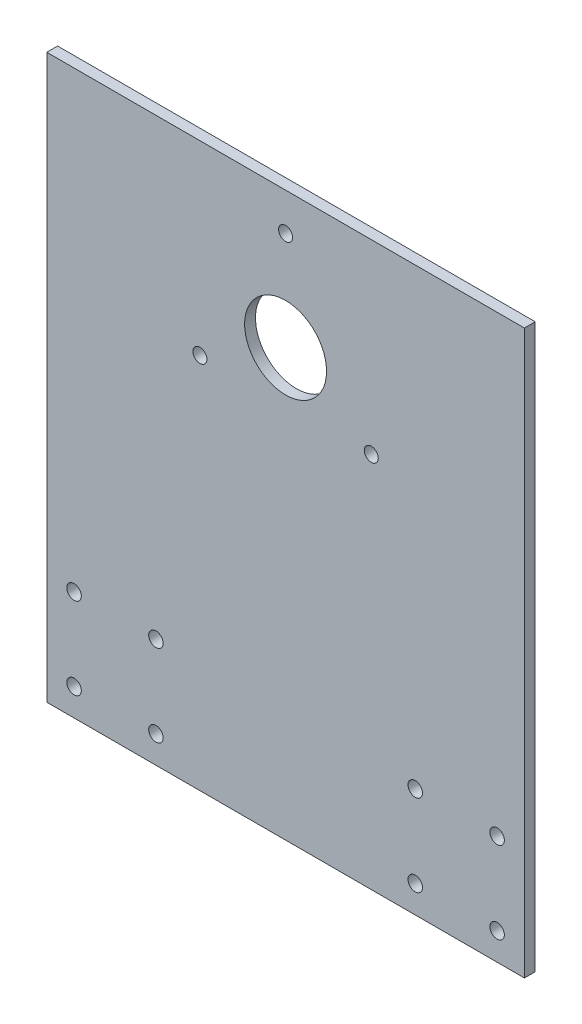
ISO-10303-21;
HEADER;
FILE_DESCRIPTION(('STEP AP214'),'2;1');
FILE_NAME('part.step','',(''),(''),'','','');
FILE_SCHEMA(('AUTOMOTIVE_DESIGN { 1 0 10303 214 1 1 1 1 }'));
ENDSEC;
DATA;
#1=APPLICATION_CONTEXT('core data for automotive mechanical design processes');
#2=APPLICATION_PROTOCOL_DEFINITION('international standard','automotive_design',2000,#1);
#3=PRODUCT_CONTEXT('',#1,'mechanical');
#4=PRODUCT('Part','Part','',(#3));
#5=PRODUCT_RELATED_PRODUCT_CATEGORY('part','',(#4));
#6=PRODUCT_DEFINITION_FORMATION('','',#4);
#7=PRODUCT_DEFINITION_CONTEXT('part definition',#1,'design');
#8=PRODUCT_DEFINITION('design','',#6,#7);
#9=PRODUCT_DEFINITION_SHAPE('','',#8);
#10=(LENGTH_UNIT() NAMED_UNIT(*) SI_UNIT(.MILLI.,.METRE.));
#11=(NAMED_UNIT(*) PLANE_ANGLE_UNIT() SI_UNIT($,.RADIAN.));
#12=(NAMED_UNIT(*) SI_UNIT($,.STERADIAN.) SOLID_ANGLE_UNIT());
#13=UNCERTAINTY_MEASURE_WITH_UNIT(LENGTH_MEASURE(1.E-05),#10,'distance_accuracy_value','');
#14=(GEOMETRIC_REPRESENTATION_CONTEXT(3) GLOBAL_UNCERTAINTY_ASSIGNED_CONTEXT((#13)) GLOBAL_UNIT_ASSIGNED_CONTEXT((#10,
#11,#12)) REPRESENTATION_CONTEXT('',''));
#15=CARTESIAN_POINT('',(0.,0.,0.));
#16=DIRECTION('',(0.,0.,1.));
#17=DIRECTION('',(1.,0.,0.));
#18=AXIS2_PLACEMENT_3D('',#15,#16,#17);
#19=CARTESIAN_POINT('',(0.,0.,3.175));
#20=DIRECTION('',(0.,0.,-1.));
#21=DIRECTION('',(-1.,0.,0.));
#22=AXIS2_PLACEMENT_3D('',#19,#20,#21);
#23=PLANE('',#22);
#24=DIRECTION('',(0.,1.,0.));
#25=VECTOR('',#24,1.);
#26=CARTESIAN_POINT('',(70.,-82.5000000000001,3.175));
#27=LINE('',#26,#25);
#28=CARTESIAN_POINT('',(70.,-82.5000000000001,3.175));
#29=VERTEX_POINT('',#28);
#30=CARTESIAN_POINT('',(70.,82.4999999999999,3.175));
#31=VERTEX_POINT('',#30);
#32=EDGE_CURVE('E98',#29,#31,#27,.T.);
#33=ORIENTED_EDGE('',*,*,#32,.T.);
#34=DIRECTION('',(-1.,0.,0.));
#35=VECTOR('',#34,1.);
#36=CARTESIAN_POINT('',(-70.,82.4999999999999,3.175));
#37=LINE('',#36,#35);
#38=CARTESIAN_POINT('',(-70.,82.4999999999999,3.175));
#39=VERTEX_POINT('',#38);
#40=EDGE_CURVE('E93',#31,#39,#37,.T.);
#41=ORIENTED_EDGE('',*,*,#40,.T.);
#42=DIRECTION('',(0.,-1.,0.));
#43=VECTOR('',#42,1.);
#44=CARTESIAN_POINT('',(-70.,-82.5000000000001,3.175));
#45=LINE('',#44,#43);
#46=CARTESIAN_POINT('',(-70.,-82.5000000000001,3.175));
#47=VERTEX_POINT('',#46);
#48=EDGE_CURVE('E96',#39,#47,#45,.T.);
#49=ORIENTED_EDGE('',*,*,#48,.T.);
#50=DIRECTION('',(1.,0.,0.));
#51=VECTOR('',#50,1.);
#52=CARTESIAN_POINT('',(-70.,-82.5000000000001,3.175));
#53=LINE('',#52,#51);
#54=EDGE_CURVE('E63',#47,#29,#53,.T.);
#55=ORIENTED_EDGE('',*,*,#54,.T.);
#56=EDGE_LOOP('',(#33,#41,#49,#55));
#57=FACE_BOUND('',#56,.T.);
#58=CARTESIAN_POINT('',(0.,71.4999999999999,3.175));
#59=DIRECTION('',(0.,0.,1.));
#60=DIRECTION('',(1.,0.,0.));
#61=AXIS2_PLACEMENT_3D('',#58,#59,#60);
#62=CIRCLE('',#61,2.05);
#63=CARTESIAN_POINT('',(2.05,71.4999999999999,3.175));
#64=VERTEX_POINT('',#63);
#65=EDGE_CURVE('E118',#64,#64,#62,.T.);
#66=ORIENTED_EDGE('',*,*,#65,.F.);
#67=EDGE_LOOP('',(#66));
#68=FACE_BOUND('',#67,.T.);
#69=CARTESIAN_POINT('',(-62.,-74.5000000000001,3.175));
#70=DIRECTION('',(0.,0.,1.));
#71=DIRECTION('',(1.,0.,0.));
#72=AXIS2_PLACEMENT_3D('',#69,#70,#71);
#73=CIRCLE('',#72,2.125);
#74=CARTESIAN_POINT('',(-59.875,-74.5000000000001,3.175));
#75=VERTEX_POINT('',#74);
#76=EDGE_CURVE('E140',#75,#75,#73,.T.);
#77=ORIENTED_EDGE('',*,*,#76,.F.);
#78=EDGE_LOOP('',(#77));
#79=FACE_BOUND('',#78,.T.);
#80=CARTESIAN_POINT('',(25.1147367097487,27.9999999999999,3.175));
#81=DIRECTION('',(0.,0.,1.));
#82=DIRECTION('',(1.,0.,0.));
#83=AXIS2_PLACEMENT_3D('',#80,#81,#82);
#84=CIRCLE('',#83,2.04999999999999);
#85=CARTESIAN_POINT('',(27.1647367097487,27.9999999999999,3.175));
#86=VERTEX_POINT('',#85);
#87=EDGE_CURVE('E148',#86,#86,#84,.T.);
#88=ORIENTED_EDGE('',*,*,#87,.F.);
#89=EDGE_LOOP('',(#88));
#90=FACE_BOUND('',#89,.T.);
#91=CARTESIAN_POINT('',(-25.1147367097487,27.9999999999999,3.175));
#92=DIRECTION('',(0.,0.,1.));
#93=DIRECTION('',(1.,0.,0.));
#94=AXIS2_PLACEMENT_3D('',#91,#92,#93);
#95=CIRCLE('',#94,2.04999999999999);
#96=CARTESIAN_POINT('',(-23.0647367097487,27.9999999999999,3.175));
#97=VERTEX_POINT('',#96);
#98=EDGE_CURVE('E156',#97,#97,#95,.T.);
#99=ORIENTED_EDGE('',*,*,#98,.F.);
#100=EDGE_LOOP('',(#99));
#101=FACE_BOUND('',#100,.T.);
#102=CARTESIAN_POINT('',(-38.,-74.5000000000001,3.175));
#103=DIRECTION('',(0.,0.,1.));
#104=DIRECTION('',(-1.,0.,0.));
#105=AXIS2_PLACEMENT_3D('',#102,#103,#104);
#106=CIRCLE('',#105,2.125);
#107=CARTESIAN_POINT('',(-40.125,-74.5000000000001,3.175));
#108=VERTEX_POINT('',#107);
#109=EDGE_CURVE('E164',#108,#108,#106,.T.);
#110=ORIENTED_EDGE('',*,*,#109,.F.);
#111=EDGE_LOOP('',(#110));
#112=FACE_BOUND('',#111,.T.);
#113=CARTESIAN_POINT('',(-38.,-50.5000000000001,3.175));
#114=DIRECTION('',(0.,0.,1.));
#115=DIRECTION('',(1.,0.,0.));
#116=AXIS2_PLACEMENT_3D('',#113,#114,#115);
#117=CIRCLE('',#116,2.125);
#118=CARTESIAN_POINT('',(-35.875,-50.5000000000001,3.175));
#119=VERTEX_POINT('',#118);
#120=EDGE_CURVE('E172',#119,#119,#117,.T.);
#121=ORIENTED_EDGE('',*,*,#120,.F.);
#122=EDGE_LOOP('',(#121));
#123=FACE_BOUND('',#122,.T.);
#124=CARTESIAN_POINT('',(-62.,-50.5000000000001,3.175));
#125=DIRECTION('',(0.,0.,1.));
#126=DIRECTION('',(-1.,0.,0.));
#127=AXIS2_PLACEMENT_3D('',#124,#125,#126);
#128=CIRCLE('',#127,2.125);
#129=CARTESIAN_POINT('',(-64.125,-50.5000000000001,3.175));
#130=VERTEX_POINT('',#129);
#131=EDGE_CURVE('E180',#130,#130,#128,.T.);
#132=ORIENTED_EDGE('',*,*,#131,.F.);
#133=EDGE_LOOP('',(#132));
#134=FACE_BOUND('',#133,.T.);
#135=CARTESIAN_POINT('',(38.0000000000001,-74.5000000000001,3.175));
#136=DIRECTION('',(0.,0.,1.));
#137=DIRECTION('',(1.,0.,0.));
#138=AXIS2_PLACEMENT_3D('',#135,#136,#137);
#139=CIRCLE('',#138,2.125);
#140=CARTESIAN_POINT('',(40.1250000000001,-74.5000000000001,3.175));
#141=VERTEX_POINT('',#140);
#142=EDGE_CURVE('E188',#141,#141,#139,.T.);
#143=ORIENTED_EDGE('',*,*,#142,.F.);
#144=EDGE_LOOP('',(#143));
#145=FACE_BOUND('',#144,.T.);
#146=CARTESIAN_POINT('',(62.0000000000001,-74.5000000000001,3.175));
#147=DIRECTION('',(0.,0.,1.));
#148=DIRECTION('',(-1.,0.,0.));
#149=AXIS2_PLACEMENT_3D('',#146,#147,#148);
#150=CIRCLE('',#149,2.12500000000001);
#151=CARTESIAN_POINT('',(59.875,-74.5000000000001,3.175));
#152=VERTEX_POINT('',#151);
#153=EDGE_CURVE('E196',#152,#152,#150,.T.);
#154=ORIENTED_EDGE('',*,*,#153,.F.);
#155=EDGE_LOOP('',(#154));
#156=FACE_BOUND('',#155,.T.);
#157=CARTESIAN_POINT('',(62.,-50.5000000000001,3.175));
#158=DIRECTION('',(0.,0.,1.));
#159=DIRECTION('',(1.,0.,0.));
#160=AXIS2_PLACEMENT_3D('',#157,#158,#159);
#161=CIRCLE('',#160,2.12500000000001);
#162=CARTESIAN_POINT('',(64.1250000000001,-50.5000000000001,3.175));
#163=VERTEX_POINT('',#162);
#164=EDGE_CURVE('E204',#163,#163,#161,.T.);
#165=ORIENTED_EDGE('',*,*,#164,.F.);
#166=EDGE_LOOP('',(#165));
#167=FACE_BOUND('',#166,.T.);
#168=CARTESIAN_POINT('',(38.0000000000001,-50.5000000000001,3.175));
#169=DIRECTION('',(0.,0.,1.));
#170=DIRECTION('',(-1.,0.,0.));
#171=AXIS2_PLACEMENT_3D('',#168,#169,#170);
#172=CIRCLE('',#171,2.125);
#173=CARTESIAN_POINT('',(35.875,-50.5000000000001,3.175));
#174=VERTEX_POINT('',#173);
#175=EDGE_CURVE('E212',#174,#174,#172,.T.);
#176=ORIENTED_EDGE('',*,*,#175,.F.);
#177=EDGE_LOOP('',(#176));
#178=FACE_BOUND('',#177,.T.);
#179=CARTESIAN_POINT('',(0.,42.4999999999999,3.175));
#180=DIRECTION('',(0.,0.,1.));
#181=DIRECTION('',(1.,0.,0.));
#182=AXIS2_PLACEMENT_3D('',#179,#180,#181);
#183=CIRCLE('',#182,12.);
#184=CARTESIAN_POINT('',(12.,42.4999999999999,3.175));
#185=VERTEX_POINT('',#184);
#186=EDGE_CURVE('E220',#185,#185,#183,.T.);
#187=ORIENTED_EDGE('',*,*,#186,.F.);
#188=EDGE_LOOP('',(#187));
#189=FACE_BOUND('',#188,.T.);
#190=ADVANCED_FACE('F45',(#57,#68,#79,#90,#101,#112,#123,#134,#145,#156,#167,#178,#189),#23,.F.);
#191=CARTESIAN_POINT('',(0.,0.,0.));
#192=DIRECTION('',(0.,0.,-1.));
#193=DIRECTION('',(-1.,0.,0.));
#194=AXIS2_PLACEMENT_3D('',#191,#192,#193);
#195=PLANE('',#194);
#196=CARTESIAN_POINT('',(38.0000000000001,-50.5000000000001,0.));
#197=DIRECTION('',(0.,0.,1.));
#198=DIRECTION('',(-1.,0.,0.));
#199=AXIS2_PLACEMENT_3D('',#196,#197,#198);
#200=CIRCLE('',#199,2.125);
#201=CARTESIAN_POINT('',(35.875,-50.5000000000001,0.));
#202=VERTEX_POINT('',#201);
#203=EDGE_CURVE('E216',#202,#202,#200,.T.);
#204=ORIENTED_EDGE('',*,*,#203,.T.);
#205=EDGE_LOOP('',(#204));
#206=FACE_BOUND('',#205,.T.);
#207=CARTESIAN_POINT('',(62.0000000000001,-74.5000000000001,0.));
#208=DIRECTION('',(0.,0.,1.));
#209=DIRECTION('',(-1.,0.,0.));
#210=AXIS2_PLACEMENT_3D('',#207,#208,#209);
#211=CIRCLE('',#210,2.12500000000001);
#212=CARTESIAN_POINT('',(59.875,-74.5000000000001,0.));
#213=VERTEX_POINT('',#212);
#214=EDGE_CURVE('E200',#213,#213,#211,.T.);
#215=ORIENTED_EDGE('',*,*,#214,.T.);
#216=EDGE_LOOP('',(#215));
#217=FACE_BOUND('',#216,.T.);
#218=CARTESIAN_POINT('',(-62.,-50.5000000000001,0.));
#219=DIRECTION('',(0.,0.,1.));
#220=DIRECTION('',(-1.,0.,0.));
#221=AXIS2_PLACEMENT_3D('',#218,#219,#220);
#222=CIRCLE('',#221,2.125);
#223=CARTESIAN_POINT('',(-64.125,-50.5000000000001,0.));
#224=VERTEX_POINT('',#223);
#225=EDGE_CURVE('E184',#224,#224,#222,.T.);
#226=ORIENTED_EDGE('',*,*,#225,.T.);
#227=EDGE_LOOP('',(#226));
#228=FACE_BOUND('',#227,.T.);
#229=CARTESIAN_POINT('',(-38.,-74.5000000000001,0.));
#230=DIRECTION('',(0.,0.,1.));
#231=DIRECTION('',(-1.,0.,0.));
#232=AXIS2_PLACEMENT_3D('',#229,#230,#231);
#233=CIRCLE('',#232,2.125);
#234=CARTESIAN_POINT('',(-40.125,-74.5000000000001,0.));
#235=VERTEX_POINT('',#234);
#236=EDGE_CURVE('E168',#235,#235,#233,.T.);
#237=ORIENTED_EDGE('',*,*,#236,.T.);
#238=EDGE_LOOP('',(#237));
#239=FACE_BOUND('',#238,.T.);
#240=CARTESIAN_POINT('',(25.1147367097487,27.9999999999999,0.));
#241=DIRECTION('',(0.,0.,1.));
#242=DIRECTION('',(1.,0.,0.));
#243=AXIS2_PLACEMENT_3D('',#240,#241,#242);
#244=CIRCLE('',#243,2.04999999999999);
#245=CARTESIAN_POINT('',(27.1647367097487,27.9999999999999,0.));
#246=VERTEX_POINT('',#245);
#247=EDGE_CURVE('E152',#246,#246,#244,.T.);
#248=ORIENTED_EDGE('',*,*,#247,.T.);
#249=EDGE_LOOP('',(#248));
#250=FACE_BOUND('',#249,.T.);
#251=CARTESIAN_POINT('',(0.,71.4999999999999,0.));
#252=DIRECTION('',(0.,0.,1.));
#253=DIRECTION('',(1.,0.,0.));
#254=AXIS2_PLACEMENT_3D('',#251,#252,#253);
#255=CIRCLE('',#254,2.05);
#256=CARTESIAN_POINT('',(2.05,71.4999999999999,0.));
#257=VERTEX_POINT('',#256);
#258=EDGE_CURVE('E136',#257,#257,#255,.T.);
#259=ORIENTED_EDGE('',*,*,#258,.T.);
#260=EDGE_LOOP('',(#259));
#261=FACE_BOUND('',#260,.T.);
#262=DIRECTION('',(0.,1.,0.));
#263=VECTOR('',#262,1.);
#264=CARTESIAN_POINT('',(70.,-82.5000000000001,0.));
#265=LINE('',#264,#263);
#266=CARTESIAN_POINT('',(70.,-82.5000000000001,0.));
#267=VERTEX_POINT('',#266);
#268=CARTESIAN_POINT('',(70.,82.4999999999999,0.));
#269=VERTEX_POINT('',#268);
#270=EDGE_CURVE('E114',#267,#269,#265,.T.);
#271=ORIENTED_EDGE('',*,*,#270,.F.);
#272=DIRECTION('',(1.,0.,0.));
#273=VECTOR('',#272,1.);
#274=CARTESIAN_POINT('',(-70.,-82.5000000000001,0.));
#275=LINE('',#274,#273);
#276=CARTESIAN_POINT('',(-70.,-82.5000000000001,0.));
#277=VERTEX_POINT('',#276);
#278=EDGE_CURVE('E86',#277,#267,#275,.T.);
#279=ORIENTED_EDGE('',*,*,#278,.F.);
#280=DIRECTION('',(0.,-1.,0.));
#281=VECTOR('',#280,1.);
#282=CARTESIAN_POINT('',(-70.,-82.5000000000001,0.));
#283=LINE('',#282,#281);
#284=CARTESIAN_POINT('',(-70.,82.4999999999999,0.));
#285=VERTEX_POINT('',#284);
#286=EDGE_CURVE('E80',#285,#277,#283,.T.);
#287=ORIENTED_EDGE('',*,*,#286,.F.);
#288=DIRECTION('',(-1.,0.,0.));
#289=VECTOR('',#288,1.);
#290=CARTESIAN_POINT('',(-70.,82.4999999999999,0.));
#291=LINE('',#290,#289);
#292=EDGE_CURVE('E103',#269,#285,#291,.T.);
#293=ORIENTED_EDGE('',*,*,#292,.F.);
#294=EDGE_LOOP('',(#271,#279,#287,#293));
#295=FACE_BOUND('',#294,.T.);
#296=CARTESIAN_POINT('',(-62.,-74.5000000000001,0.));
#297=DIRECTION('',(0.,0.,1.));
#298=DIRECTION('',(1.,0.,0.));
#299=AXIS2_PLACEMENT_3D('',#296,#297,#298);
#300=CIRCLE('',#299,2.125);
#301=CARTESIAN_POINT('',(-59.875,-74.5000000000001,0.));
#302=VERTEX_POINT('',#301);
#303=EDGE_CURVE('E144',#302,#302,#300,.T.);
#304=ORIENTED_EDGE('',*,*,#303,.T.);
#305=EDGE_LOOP('',(#304));
#306=FACE_BOUND('',#305,.T.);
#307=CARTESIAN_POINT('',(-25.1147367097487,27.9999999999999,0.));
#308=DIRECTION('',(0.,0.,1.));
#309=DIRECTION('',(1.,0.,0.));
#310=AXIS2_PLACEMENT_3D('',#307,#308,#309);
#311=CIRCLE('',#310,2.04999999999999);
#312=CARTESIAN_POINT('',(-23.0647367097487,27.9999999999999,0.));
#313=VERTEX_POINT('',#312);
#314=EDGE_CURVE('E160',#313,#313,#311,.T.);
#315=ORIENTED_EDGE('',*,*,#314,.T.);
#316=EDGE_LOOP('',(#315));
#317=FACE_BOUND('',#316,.T.);
#318=CARTESIAN_POINT('',(-38.,-50.5000000000001,0.));
#319=DIRECTION('',(0.,0.,1.));
#320=DIRECTION('',(1.,0.,0.));
#321=AXIS2_PLACEMENT_3D('',#318,#319,#320);
#322=CIRCLE('',#321,2.125);
#323=CARTESIAN_POINT('',(-35.875,-50.5000000000001,0.));
#324=VERTEX_POINT('',#323);
#325=EDGE_CURVE('E176',#324,#324,#322,.T.);
#326=ORIENTED_EDGE('',*,*,#325,.T.);
#327=EDGE_LOOP('',(#326));
#328=FACE_BOUND('',#327,.T.);
#329=CARTESIAN_POINT('',(38.0000000000001,-74.5000000000001,0.));
#330=DIRECTION('',(0.,0.,1.));
#331=DIRECTION('',(1.,0.,0.));
#332=AXIS2_PLACEMENT_3D('',#329,#330,#331);
#333=CIRCLE('',#332,2.125);
#334=CARTESIAN_POINT('',(40.1250000000001,-74.5000000000001,0.));
#335=VERTEX_POINT('',#334);
#336=EDGE_CURVE('E192',#335,#335,#333,.T.);
#337=ORIENTED_EDGE('',*,*,#336,.T.);
#338=EDGE_LOOP('',(#337));
#339=FACE_BOUND('',#338,.T.);
#340=CARTESIAN_POINT('',(62.,-50.5000000000001,0.));
#341=DIRECTION('',(0.,0.,1.));
#342=DIRECTION('',(1.,0.,0.));
#343=AXIS2_PLACEMENT_3D('',#340,#341,#342);
#344=CIRCLE('',#343,2.12500000000001);
#345=CARTESIAN_POINT('',(64.1250000000001,-50.5000000000001,0.));
#346=VERTEX_POINT('',#345);
#347=EDGE_CURVE('E208',#346,#346,#344,.T.);
#348=ORIENTED_EDGE('',*,*,#347,.T.);
#349=EDGE_LOOP('',(#348));
#350=FACE_BOUND('',#349,.T.);
#351=CARTESIAN_POINT('',(0.,42.4999999999999,0.));
#352=DIRECTION('',(0.,0.,1.));
#353=DIRECTION('',(1.,0.,0.));
#354=AXIS2_PLACEMENT_3D('',#351,#352,#353);
#355=CIRCLE('',#354,12.);
#356=CARTESIAN_POINT('',(12.,42.4999999999999,0.));
#357=VERTEX_POINT('',#356);
#358=EDGE_CURVE('E224',#357,#357,#355,.T.);
#359=ORIENTED_EDGE('',*,*,#358,.T.);
#360=EDGE_LOOP('',(#359));
#361=FACE_BOUND('',#360,.T.);
#362=ADVANCED_FACE('F131',(#206,#217,#228,#239,#250,#261,#295,#306,#317,#328,#339,#350,#361),
#195,.T.);
#363=CARTESIAN_POINT('',(70.,-82.5000000000001,3.175));
#364=DIRECTION('',(-1.,0.,0.));
#365=DIRECTION('',(0.,-1.,0.));
#366=AXIS2_PLACEMENT_3D('',#363,#364,#365);
#367=PLANE('',#366);
#368=ORIENTED_EDGE('',*,*,#270,.T.);
#369=DIRECTION('',(0.,0.,-1.));
#370=VECTOR('',#369,1.);
#371=CARTESIAN_POINT('',(70.,82.4999999999999,3.175));
#372=LINE('',#371,#370);
#373=EDGE_CURVE('E11',#31,#269,#372,.T.);
#374=ORIENTED_EDGE('',*,*,#373,.F.);
#375=ORIENTED_EDGE('',*,*,#32,.F.);
#376=DIRECTION('',(0.,0.,-1.));
#377=VECTOR('',#376,1.);
#378=CARTESIAN_POINT('',(70.,-82.5000000000001,3.175));
#379=LINE('',#378,#377);
#380=EDGE_CURVE('E110',#29,#267,#379,.T.);
#381=ORIENTED_EDGE('',*,*,#380,.T.);
#382=EDGE_LOOP('',(#368,#374,#375,#381));
#383=FACE_BOUND('',#382,.T.);
#384=ADVANCED_FACE('F47',(#383),#367,.F.);
#385=CARTESIAN_POINT('',(-70.,82.4999999999999,3.175));
#386=DIRECTION('',(0.,-1.,0.));
#387=DIRECTION('',(1.,0.,0.));
#388=AXIS2_PLACEMENT_3D('',#385,#386,#387);
#389=PLANE('',#388);
#390=ORIENTED_EDGE('',*,*,#292,.T.);
#391=DIRECTION('',(0.,0.,-1.));
#392=VECTOR('',#391,1.);
#393=CARTESIAN_POINT('',(-70.,82.4999999999999,3.175));
#394=LINE('',#393,#392);
#395=EDGE_CURVE('E55',#39,#285,#394,.T.);
#396=ORIENTED_EDGE('',*,*,#395,.F.);
#397=ORIENTED_EDGE('',*,*,#40,.F.);
#398=ORIENTED_EDGE('',*,*,#373,.T.);
#399=EDGE_LOOP('',(#390,#396,#397,#398));
#400=FACE_BOUND('',#399,.T.);
#401=ADVANCED_FACE('F102',(#400),#389,.F.);
#402=CARTESIAN_POINT('',(-70.,-82.5000000000001,3.175));
#403=DIRECTION('',(1.,0.,0.));
#404=DIRECTION('',(0.,0.,-1.));
#405=AXIS2_PLACEMENT_3D('',#402,#403,#404);
#406=PLANE('',#405);
#407=ORIENTED_EDGE('',*,*,#286,.T.);
#408=DIRECTION('',(0.,0.,-1.));
#409=VECTOR('',#408,1.);
#410=CARTESIAN_POINT('',(-70.,-82.5000000000001,3.175));
#411=LINE('',#410,#409);
#412=EDGE_CURVE('E105',#47,#277,#411,.T.);
#413=ORIENTED_EDGE('',*,*,#412,.F.);
#414=ORIENTED_EDGE('',*,*,#48,.F.);
#415=ORIENTED_EDGE('',*,*,#395,.T.);
#416=EDGE_LOOP('',(#407,#413,#414,#415));
#417=FACE_BOUND('',#416,.T.);
#418=ADVANCED_FACE('F106',(#417),#406,.F.);
#419=CARTESIAN_POINT('',(-70.,-82.5000000000001,3.175));
#420=DIRECTION('',(0.,1.,0.));
#421=DIRECTION('',(-1.,0.,0.));
#422=AXIS2_PLACEMENT_3D('',#419,#420,#421);
#423=PLANE('',#422);
#424=ORIENTED_EDGE('',*,*,#278,.T.);
#425=ORIENTED_EDGE('',*,*,#380,.F.);
#426=ORIENTED_EDGE('',*,*,#54,.F.);
#427=ORIENTED_EDGE('',*,*,#412,.T.);
#428=EDGE_LOOP('',(#424,#425,#426,#427));
#429=FACE_BOUND('',#428,.T.);
#430=ADVANCED_FACE('F128',(#429),#423,.F.);
#431=CARTESIAN_POINT('',(0.,71.4999999999999,3.175));
#432=DIRECTION('',(0.,0.,-1.));
#433=DIRECTION('',(-1.,0.,0.));
#434=AXIS2_PLACEMENT_3D('',#431,#432,#433);
#435=CYLINDRICAL_SURFACE('',#434,2.05);
#436=ORIENTED_EDGE('',*,*,#65,.T.);
#437=EDGE_LOOP('',(#436));
#438=FACE_BOUND('',#437,.T.);
#439=ORIENTED_EDGE('',*,*,#258,.F.);
#440=EDGE_LOOP('',(#439));
#441=FACE_BOUND('',#440,.T.);
#442=ADVANCED_FACE('F243',(#438,#441),#435,.F.);
#443=CARTESIAN_POINT('',(-62.,-74.5000000000001,3.175));
#444=DIRECTION('',(0.,0.,-1.));
#445=DIRECTION('',(-1.,0.,0.));
#446=AXIS2_PLACEMENT_3D('',#443,#444,#445);
#447=CYLINDRICAL_SURFACE('',#446,2.125);
#448=ORIENTED_EDGE('',*,*,#76,.T.);
#449=EDGE_LOOP('',(#448));
#450=FACE_BOUND('',#449,.T.);
#451=ORIENTED_EDGE('',*,*,#303,.F.);
#452=EDGE_LOOP('',(#451));
#453=FACE_BOUND('',#452,.T.);
#454=ADVANCED_FACE('F288',(#450,#453),#447,.F.);
#455=CARTESIAN_POINT('',(25.1147367097487,27.9999999999999,3.175));
#456=DIRECTION('',(0.,0.,-1.));
#457=DIRECTION('',(-1.,0.,0.));
#458=AXIS2_PLACEMENT_3D('',#455,#456,#457);
#459=CYLINDRICAL_SURFACE('',#458,2.04999999999999);
#460=ORIENTED_EDGE('',*,*,#87,.T.);
#461=EDGE_LOOP('',(#460));
#462=FACE_BOUND('',#461,.T.);
#463=ORIENTED_EDGE('',*,*,#247,.F.);
#464=EDGE_LOOP('',(#463));
#465=FACE_BOUND('',#464,.T.);
#466=ADVANCED_FACE('F296',(#462,#465),#459,.F.);
#467=CARTESIAN_POINT('',(-25.1147367097487,27.9999999999999,3.175));
#468=DIRECTION('',(0.,0.,-1.));
#469=DIRECTION('',(-1.,0.,0.));
#470=AXIS2_PLACEMENT_3D('',#467,#468,#469);
#471=CYLINDRICAL_SURFACE('',#470,2.04999999999999);
#472=ORIENTED_EDGE('',*,*,#98,.T.);
#473=EDGE_LOOP('',(#472));
#474=FACE_BOUND('',#473,.T.);
#475=ORIENTED_EDGE('',*,*,#314,.F.);
#476=EDGE_LOOP('',(#475));
#477=FACE_BOUND('',#476,.T.);
#478=ADVANCED_FACE('F304',(#474,#477),#471,.F.);
#479=CARTESIAN_POINT('',(-38.,-74.5000000000001,3.175));
#480=DIRECTION('',(0.,0.,-1.));
#481=DIRECTION('',(-1.,0.,0.));
#482=AXIS2_PLACEMENT_3D('',#479,#480,#481);
#483=CYLINDRICAL_SURFACE('',#482,2.125);
#484=ORIENTED_EDGE('',*,*,#109,.T.);
#485=EDGE_LOOP('',(#484));
#486=FACE_BOUND('',#485,.T.);
#487=ORIENTED_EDGE('',*,*,#236,.F.);
#488=EDGE_LOOP('',(#487));
#489=FACE_BOUND('',#488,.T.);
#490=ADVANCED_FACE('F313',(#486,#489),#483,.F.);
#491=CARTESIAN_POINT('',(-38.,-50.5000000000001,3.175));
#492=DIRECTION('',(0.,0.,-1.));
#493=DIRECTION('',(-1.,0.,0.));
#494=AXIS2_PLACEMENT_3D('',#491,#492,#493);
#495=CYLINDRICAL_SURFACE('',#494,2.125);
#496=ORIENTED_EDGE('',*,*,#120,.T.);
#497=EDGE_LOOP('',(#496));
#498=FACE_BOUND('',#497,.T.);
#499=ORIENTED_EDGE('',*,*,#325,.F.);
#500=EDGE_LOOP('',(#499));
#501=FACE_BOUND('',#500,.T.);
#502=ADVANCED_FACE('F322',(#498,#501),#495,.F.);
#503=CARTESIAN_POINT('',(-62.,-50.5000000000001,3.175));
#504=DIRECTION('',(0.,0.,-1.));
#505=DIRECTION('',(-1.,0.,0.));
#506=AXIS2_PLACEMENT_3D('',#503,#504,#505);
#507=CYLINDRICAL_SURFACE('',#506,2.125);
#508=ORIENTED_EDGE('',*,*,#131,.T.);
#509=EDGE_LOOP('',(#508));
#510=FACE_BOUND('',#509,.T.);
#511=ORIENTED_EDGE('',*,*,#225,.F.);
#512=EDGE_LOOP('',(#511));
#513=FACE_BOUND('',#512,.T.);
#514=ADVANCED_FACE('F331',(#510,#513),#507,.F.);
#515=CARTESIAN_POINT('',(38.0000000000001,-74.5000000000001,3.175));
#516=DIRECTION('',(0.,0.,-1.));
#517=DIRECTION('',(-1.,0.,0.));
#518=AXIS2_PLACEMENT_3D('',#515,#516,#517);
#519=CYLINDRICAL_SURFACE('',#518,2.125);
#520=ORIENTED_EDGE('',*,*,#142,.T.);
#521=EDGE_LOOP('',(#520));
#522=FACE_BOUND('',#521,.T.);
#523=ORIENTED_EDGE('',*,*,#336,.F.);
#524=EDGE_LOOP('',(#523));
#525=FACE_BOUND('',#524,.T.);
#526=ADVANCED_FACE('F340',(#522,#525),#519,.F.);
#527=CARTESIAN_POINT('',(62.0000000000001,-74.5000000000001,3.175));
#528=DIRECTION('',(0.,0.,-1.));
#529=DIRECTION('',(-1.,0.,0.));
#530=AXIS2_PLACEMENT_3D('',#527,#528,#529);
#531=CYLINDRICAL_SURFACE('',#530,2.12500000000001);
#532=ORIENTED_EDGE('',*,*,#153,.T.);
#533=EDGE_LOOP('',(#532));
#534=FACE_BOUND('',#533,.T.);
#535=ORIENTED_EDGE('',*,*,#214,.F.);
#536=EDGE_LOOP('',(#535));
#537=FACE_BOUND('',#536,.T.);
#538=ADVANCED_FACE('F349',(#534,#537),#531,.F.);
#539=CARTESIAN_POINT('',(62.,-50.5000000000001,3.175));
#540=DIRECTION('',(0.,0.,-1.));
#541=DIRECTION('',(-1.,0.,0.));
#542=AXIS2_PLACEMENT_3D('',#539,#540,#541);
#543=CYLINDRICAL_SURFACE('',#542,2.12500000000001);
#544=ORIENTED_EDGE('',*,*,#164,.T.);
#545=EDGE_LOOP('',(#544));
#546=FACE_BOUND('',#545,.T.);
#547=ORIENTED_EDGE('',*,*,#347,.F.);
#548=EDGE_LOOP('',(#547));
#549=FACE_BOUND('',#548,.T.);
#550=ADVANCED_FACE('F358',(#546,#549),#543,.F.);
#551=CARTESIAN_POINT('',(38.0000000000001,-50.5000000000001,3.175));
#552=DIRECTION('',(0.,0.,-1.));
#553=DIRECTION('',(-1.,0.,0.));
#554=AXIS2_PLACEMENT_3D('',#551,#552,#553);
#555=CYLINDRICAL_SURFACE('',#554,2.125);
#556=ORIENTED_EDGE('',*,*,#175,.T.);
#557=EDGE_LOOP('',(#556));
#558=FACE_BOUND('',#557,.T.);
#559=ORIENTED_EDGE('',*,*,#203,.F.);
#560=EDGE_LOOP('',(#559));
#561=FACE_BOUND('',#560,.T.);
#562=ADVANCED_FACE('F367',(#558,#561),#555,.F.);
#563=CARTESIAN_POINT('',(0.,42.4999999999999,3.175));
#564=DIRECTION('',(0.,0.,-1.));
#565=DIRECTION('',(-1.,0.,0.));
#566=AXIS2_PLACEMENT_3D('',#563,#564,#565);
#567=CYLINDRICAL_SURFACE('',#566,12.);
#568=ORIENTED_EDGE('',*,*,#186,.T.);
#569=EDGE_LOOP('',(#568));
#570=FACE_BOUND('',#569,.T.);
#571=ORIENTED_EDGE('',*,*,#358,.F.);
#572=EDGE_LOOP('',(#571));
#573=FACE_BOUND('',#572,.T.);
#574=ADVANCED_FACE('F232',(#570,#573),#567,.F.);
#575=CLOSED_SHELL('',(#190,#362,#384,#401,#418,#430,#442,#454,#466,#478,#490,#502,#514,#526,
#538,#550,#562,#574));
#576=MANIFOLD_SOLID_BREP('B2',#575);
#577=ADVANCED_BREP_SHAPE_REPRESENTATION('',(#18,#576),#14);
#578=SHAPE_DEFINITION_REPRESENTATION(#9,#577);
ENDSEC;
END-ISO-10303-21;
